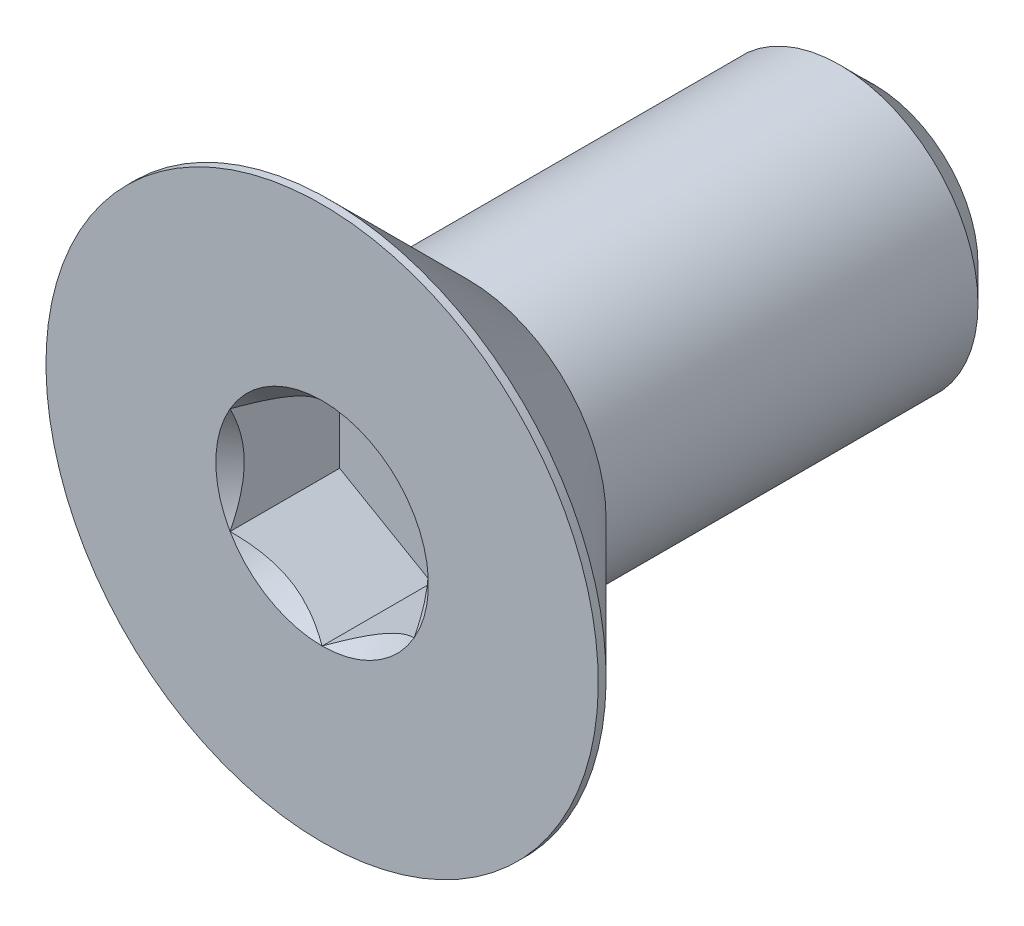
ISO-10303-21;
HEADER;
FILE_DESCRIPTION(('STEP AP214'),'2;1');
FILE_NAME('part.step','',(''),(''),'','','');
FILE_SCHEMA(('AUTOMOTIVE_DESIGN { 1 0 10303 214 1 1 1 1 }'));
ENDSEC;
DATA;
#1=APPLICATION_CONTEXT('core data for automotive mechanical design processes');
#2=APPLICATION_PROTOCOL_DEFINITION('international standard','automotive_design',2000,#1);
#3=PRODUCT_CONTEXT('',#1,'mechanical');
#4=PRODUCT('Part','Part','',(#3));
#5=PRODUCT_RELATED_PRODUCT_CATEGORY('part','',(#4));
#6=PRODUCT_DEFINITION_FORMATION('','',#4);
#7=PRODUCT_DEFINITION_CONTEXT('part definition',#1,'design');
#8=PRODUCT_DEFINITION('design','',#6,#7);
#9=PRODUCT_DEFINITION_SHAPE('','',#8);
#10=(LENGTH_UNIT() NAMED_UNIT(*) SI_UNIT(.MILLI.,.METRE.));
#11=(NAMED_UNIT(*) PLANE_ANGLE_UNIT() SI_UNIT($,.RADIAN.));
#12=(NAMED_UNIT(*) SI_UNIT($,.STERADIAN.) SOLID_ANGLE_UNIT());
#13=UNCERTAINTY_MEASURE_WITH_UNIT(LENGTH_MEASURE(1.E-05),#10,'distance_accuracy_value','');
#14=(GEOMETRIC_REPRESENTATION_CONTEXT(3) GLOBAL_UNCERTAINTY_ASSIGNED_CONTEXT((#13)) GLOBAL_UNIT_ASSIGNED_CONTEXT((#10,
#11,#12)) REPRESENTATION_CONTEXT('',''));
#15=CARTESIAN_POINT('',(0.,0.,0.));
#16=DIRECTION('',(0.,0.,1.));
#17=DIRECTION('',(1.,0.,0.));
#18=AXIS2_PLACEMENT_3D('',#15,#16,#17);
#19=CARTESIAN_POINT('',(0.,0.,2.915));
#20=DIRECTION('',(0.,0.,1.));
#21=DIRECTION('',(0.,-1.,0.));
#22=AXIS2_PLACEMENT_3D('',#19,#20,#21);
#23=CONICAL_SURFACE('',#22,3.,0.785398163397448);
#24=CARTESIAN_POINT('',(0.,0.,2.915));
#25=DIRECTION('',(0.,0.,1.));
#26=DIRECTION('',(0.,-1.,0.));
#27=AXIS2_PLACEMENT_3D('',#24,#25,#26);
#28=CIRCLE('',#27,3.);
#29=CARTESIAN_POINT('',(0.,-3.,2.915));
#30=VERTEX_POINT('',#29);
#31=EDGE_CURVE('E48',#30,#30,#28,.T.);
#32=ORIENTED_EDGE('',*,*,#31,.F.);
#33=EDGE_LOOP('',(#32));
#34=FACE_BOUND('',#33,.T.);
#35=CARTESIAN_POINT('',(0.,0.,1.41500000000001));
#36=DIRECTION('',(0.,0.,1.));
#37=DIRECTION('',(0.,-1.,0.));
#38=AXIS2_PLACEMENT_3D('',#35,#36,#37);
#39=CIRCLE('',#38,1.50000000000001);
#40=CARTESIAN_POINT('',(0.,-1.50000000000001,1.41500000000001));
#41=VERTEX_POINT('',#40);
#42=EDGE_CURVE('E43',#41,#41,#39,.T.);
#43=ORIENTED_EDGE('',*,*,#42,.T.);
#44=EDGE_LOOP('',(#43));
#45=FACE_BOUND('',#44,.T.);
#46=ADVANCED_FACE('F40',(#34,#45),#23,.T.);
#47=CARTESIAN_POINT('',(0.,0.,3.));
#48=DIRECTION('',(0.,0.,-1.));
#49=DIRECTION('',(0.,1.,0.));
#50=AXIS2_PLACEMENT_3D('',#47,#48,#49);
#51=PLANE('',#50);
#52=CARTESIAN_POINT('',(0.,0.,3.));
#53=DIRECTION('',(0.,0.,1.));
#54=DIRECTION('',(0.,-1.,0.));
#55=AXIS2_PLACEMENT_3D('',#52,#53,#54);
#56=CIRCLE('',#55,3.);
#57=CARTESIAN_POINT('',(0.,-3.,3.));
#58=VERTEX_POINT('',#57);
#59=EDGE_CURVE('E257',#58,#58,#56,.T.);
#60=ORIENTED_EDGE('',*,*,#59,.T.);
#61=EDGE_LOOP('',(#60));
#62=FACE_BOUND('',#61,.T.);
#63=CARTESIAN_POINT('',(0.,0.,3.));
#64=DIRECTION('',(0.,0.,-1.));
#65=DIRECTION('',(-1.,0.,0.));
#66=AXIS2_PLACEMENT_3D('',#63,#64,#65);
#67=CIRCLE('',#66,1.15470053837925);
#68=CARTESIAN_POINT('',(-1.,0.577350269189623,3.));
#69=VERTEX_POINT('',#68);
#70=CARTESIAN_POINT('',(0.,1.15470053837925,3.));
#71=VERTEX_POINT('',#70);
#72=EDGE_CURVE('E130',#69,#71,#67,.T.);
#73=ORIENTED_EDGE('',*,*,#72,.T.);
#74=CARTESIAN_POINT('',(1.,0.577350269189625,3.));
#75=VERTEX_POINT('',#74);
#76=EDGE_CURVE('E129',#71,#75,#67,.T.);
#77=ORIENTED_EDGE('',*,*,#76,.T.);
#78=CARTESIAN_POINT('',(1.,-0.577350269189626,3.));
#79=VERTEX_POINT('',#78);
#80=EDGE_CURVE('E100',#75,#79,#67,.T.);
#81=ORIENTED_EDGE('',*,*,#80,.T.);
#82=CARTESIAN_POINT('',(0.,-1.15470053837925,3.));
#83=VERTEX_POINT('',#82);
#84=EDGE_CURVE('E93',#79,#83,#67,.T.);
#85=ORIENTED_EDGE('',*,*,#84,.T.);
#86=CARTESIAN_POINT('',(-1.,-0.577350269189628,3.));
#87=VERTEX_POINT('',#86);
#88=EDGE_CURVE('E54',#83,#87,#67,.T.);
#89=ORIENTED_EDGE('',*,*,#88,.T.);
#90=EDGE_CURVE('E61',#87,#69,#67,.T.);
#91=ORIENTED_EDGE('',*,*,#90,.T.);
#92=EDGE_LOOP('',(#73,#77,#81,#85,#89,#91));
#93=FACE_BOUND('',#92,.T.);
#94=ADVANCED_FACE('F128',(#62,#93),#51,.F.);
#95=CARTESIAN_POINT('',(0.,0.,3.));
#96=DIRECTION('',(0.,0.,1.));
#97=DIRECTION('',(0.,-1.,0.));
#98=AXIS2_PLACEMENT_3D('',#95,#96,#97);
#99=CYLINDRICAL_SURFACE('',#98,3.);
#100=ORIENTED_EDGE('',*,*,#31,.T.);
#101=EDGE_LOOP('',(#100));
#102=FACE_BOUND('',#101,.T.);
#103=ORIENTED_EDGE('',*,*,#59,.F.);
#104=EDGE_LOOP('',(#103));
#105=FACE_BOUND('',#104,.T.);
#106=ADVANCED_FACE('F212',(#102,#105),#99,.T.);
#107=CARTESIAN_POINT('',(0.,0.,3.));
#108=DIRECTION('',(0.,0.,1.));
#109=DIRECTION('',(-1.,0.,0.));
#110=AXIS2_PLACEMENT_3D('',#107,#108,#109);
#111=CONICAL_SURFACE('',#110,1.15470053837925,0.78539816339745);
#112=CARTESIAN_POINT('',(1.,-1.15147208646462,3.37038567751387));
#113=CARTESIAN_POINT('',(1.,-1.12343447988552,3.34921991987372));
#114=CARTESIAN_POINT('',(1.,-1.09524064850698,3.32826169217591));
#115=CARTESIAN_POINT('',(1.,-1.03847715644377,3.28684602223563));
#116=CARTESIAN_POINT('',(1.,-1.00990740382975,3.26638870612366));
#117=CARTESIAN_POINT('',(1.,-0.92312089433348,3.20560479495451));
#118=CARTESIAN_POINT('',(1.,-0.864253173759063,3.1661922289614));
#119=CARTESIAN_POINT('',(1.,-0.740809858258048,3.08882066420021));
#120=CARTESIAN_POINT('',(1.,-0.676100255137809,3.05107303911435));
#121=CARTESIAN_POINT('',(1.,-0.543448939049126,2.98202458755129));
#122=CARTESIAN_POINT('',(1.,-0.47551911202778,2.95070202784687));
#123=CARTESIAN_POINT('',(1.,-0.37355585033353,2.9123817788838));
#124=CARTESIAN_POINT('',(1.,-0.341031989670909,2.90138359164216));
#125=CARTESIAN_POINT('',(1.,-0.275199079052294,2.88199834214736));
#126=CARTESIAN_POINT('',(1.,-0.241889975173934,2.8736114597767));
#127=CARTESIAN_POINT('',(1.,-0.175247517042994,2.86002522071902));
#128=CARTESIAN_POINT('',(1.,-0.141925568218176,2.85477079076797));
#129=CARTESIAN_POINT('',(1.,-0.0749144362322797,2.84754868657089));
#130=CARTESIAN_POINT('',(1.,-0.0412251978501624,2.84558151361051));
#131=CARTESIAN_POINT('',(1.,0.0249580992634205,2.84508319839316));
#132=CARTESIAN_POINT('',(1.,0.057451282646039,2.84643026788864));
#133=CARTESIAN_POINT('',(1.,0.122148505701867,2.85221648449899));
#134=CARTESIAN_POINT('',(1.,0.154352610132926,2.85665492066154));
#135=CARTESIAN_POINT('',(1.,0.21879989886764,2.86845683014521));
#136=CARTESIAN_POINT('',(1.,0.251033743268954,2.87587054103851));
#137=CARTESIAN_POINT('',(1.,0.314797132354919,2.89322894249868));
#138=CARTESIAN_POINT('',(1.,0.346326735731005,2.90317342128883));
#139=CARTESIAN_POINT('',(1.,0.445594187730206,2.93822348255434));
#140=CARTESIAN_POINT('',(1.,0.511919139476037,2.96732085835673));
#141=CARTESIAN_POINT('',(1.,0.641453244657533,3.03201532968651));
#142=CARTESIAN_POINT('',(1.,0.704650133126345,3.06763577671524));
#143=CARTESIAN_POINT('',(1.,0.825428490174987,3.14112390134694));
#144=CARTESIAN_POINT('',(1.,0.883132947867685,3.17879194713547));
#145=CARTESIAN_POINT('',(1.,0.968148853704566,3.23702285294317));
#146=CARTESIAN_POINT('',(1.,0.996120570380285,3.25663847576286));
#147=CARTESIAN_POINT('',(1.,1.05168177729902,3.29638851706127));
#148=CARTESIAN_POINT('',(1.,1.079271369977,3.31652279219883));
#149=CARTESIAN_POINT('',(1.,1.10670185346329,3.33687211907297));
#150=B_SPLINE_CURVE_WITH_KNOTS('',3,(#112,#113,#114,#115,#116,#117,#118,#119,#120,#121,#122,
#123,#124,#125,#126,#127,#128,#129,#130,#131,#132,#133,#134,#135,#136,#137,#138,#139,#140,#141,
#142,#143,#144,#145,#146,#147,#148,#149),.UNSPECIFIED.,.F.,.F.,(4,2,2,2,2,2,2,2,2,2,2,2,2,2,2,2,
2,2,4),(0.,0.105386459083291,0.210799187330125,0.42323361156547,0.647793540908506,
0.871580877738613,0.974493074181424,1.07741235827202,1.17846428203205,1.27953161415763,
1.37694086739611,1.47432772585408,1.57343322804294,1.67253043972852,1.88917353996828,
2.10660791038813,2.31323734249844,2.41572589232045,2.51818641476504),.UNSPECIFIED.);
#151=EDGE_CURVE('E11',#75,#79,#150,.F.);
#152=ORIENTED_EDGE('',*,*,#151,.T.);
#153=ORIENTED_EDGE('',*,*,#80,.F.);
#154=EDGE_LOOP('',(#152,#153));
#155=FACE_BOUND('',#154,.T.);
#156=ADVANCED_FACE('F105',(#155),#111,.F.);
#157=CARTESIAN_POINT('',(-0.000199999999999349,1.15481600843309,3.00011548737261));
#158=CARTESIAN_POINT('',(0.0341825950071813,1.13496520795026,2.98027793082573));
#159=CARTESIAN_POINT('',(0.0691401181398255,1.11478247255942,2.96160502063889));
#160=CARTESIAN_POINT('',(0.14042280295609,1.07362739529219,2.92741474272316));
#161=CARTESIAN_POINT('',(0.176754750528984,1.0526511355808,2.91191640902346));
#162=CARTESIAN_POINT('',(0.250016613803311,1.01035337909803,2.88536730714227));
#163=CARTESIAN_POINT('',(0.286927851445414,0.989042666109241,2.87424977399693));
#164=CARTESIAN_POINT('',(0.361562729310859,0.945952199282692,2.85711986577618));
#165=CARTESIAN_POINT('',(0.399284088108636,0.924173762626597,2.85109469746667));
#166=CARTESIAN_POINT('',(0.464292198417933,0.886641312640015,2.84566055496749));
#167=CARTESIAN_POINT('',(0.491494371528172,0.870936130672276,2.84485693831673));
#168=CARTESIAN_POINT('',(0.545846040669112,0.839556179862849,2.84620669941689));
#169=CARTESIAN_POINT('',(0.572995523754876,0.823881418494924,2.8483607295472));
#170=CARTESIAN_POINT('',(0.65405627732696,0.777080970599367,2.85911697212847));
#171=CARTESIAN_POINT('',(0.707564140978427,0.746188191116431,2.87201455641536));
#172=CARTESIAN_POINT('',(0.801476065143432,0.69196811641965,2.90314073060218));
#173=CARTESIAN_POINT('',(0.842320523671835,0.668386557293372,2.91973779770184));
#174=CARTESIAN_POINT('',(0.922409637381945,0.622147085933681,2.95712492468529));
#175=CARTESIAN_POINT('',(0.96165901087044,0.599486449584575,2.9779013418174));
#176=CARTESIAN_POINT('',(1.0002,0.577234799135787,3.00011548737262));
#177=B_SPLINE_CURVE_WITH_KNOTS('',3,(#157,#158,#159,#160,#161,#162,#163,#164,#165,#166,#167,
#168,#169,#170,#171,#172,#173,#174,#175,#176),.UNSPECIFIED.,.F.,.F.,(4,2,2,2,2,2,2,2,2,4),(0.,
0.133237676828559,0.26725222983449,0.399137076269299,0.530689603280767,0.624814864263845,
0.718960890149132,0.907306626112096,1.05710100361789,1.20641411519286),.UNSPECIFIED.);
#178=EDGE_CURVE('E133',#71,#75,#177,.T.);
#179=ORIENTED_EDGE('',*,*,#178,.T.);
#180=ORIENTED_EDGE('',*,*,#76,.F.);
#181=EDGE_LOOP('',(#179,#180));
#182=FACE_BOUND('',#181,.T.);
#183=ADVANCED_FACE('F253',(#182),#111,.F.);
#184=CARTESIAN_POINT('',(-1.0002,0.577234799135787,3.00011548737261));
#185=CARTESIAN_POINT('',(-0.965817404992821,0.59708559961862,2.98027793082573));
#186=CARTESIAN_POINT('',(-0.930859881860177,0.617268335009455,2.96160502063889));
#187=CARTESIAN_POINT('',(-0.859577197043912,0.658423412276685,2.92741474272316));
#188=CARTESIAN_POINT('',(-0.823245249471017,0.679399671988079,2.91191640902346));
#189=CARTESIAN_POINT('',(-0.74998338619669,0.721697428470845,2.88536730714227));
#190=CARTESIAN_POINT('',(-0.713072148554587,0.743008141459636,2.87424977399693));
#191=CARTESIAN_POINT('',(-0.638437270689142,0.786098608286185,2.85711986577618));
#192=CARTESIAN_POINT('',(-0.600715911891365,0.80787704494228,2.85109469746667));
#193=CARTESIAN_POINT('',(-0.535707801582067,0.845409494928862,2.84566055496749));
#194=CARTESIAN_POINT('',(-0.508505628471828,0.861114676896601,2.84485693831673));
#195=CARTESIAN_POINT('',(-0.454153959330889,0.892494627706028,2.84620669941689));
#196=CARTESIAN_POINT('',(-0.427004476245125,0.908169389073953,2.8483607295472));
#197=CARTESIAN_POINT('',(-0.34594372267304,0.95496983696951,2.85911697212847));
#198=CARTESIAN_POINT('',(-0.292435859021573,0.985862616452446,2.87201455641536));
#199=CARTESIAN_POINT('',(-0.198523934856569,1.04008269114923,2.90314073060218));
#200=CARTESIAN_POINT('',(-0.157679476328166,1.06366425027551,2.91973779770184));
#201=CARTESIAN_POINT('',(-0.077590362618056,1.1099037216352,2.95712492468529));
#202=CARTESIAN_POINT('',(-0.0383409891295617,1.1325643579843,2.9779013418174));
#203=CARTESIAN_POINT('',(0.000200000000000743,1.15481600843309,3.00011548737261));
#204=B_SPLINE_CURVE_WITH_KNOTS('',3,(#184,#185,#186,#187,#188,#189,#190,#191,#192,#193,#194,
#195,#196,#197,#198,#199,#200,#201,#202,#203),.UNSPECIFIED.,.F.,.F.,(4,2,2,2,2,2,2,2,2,4),(0.,
0.133237676828559,0.267252229834491,0.399137076269301,0.53068960328077,0.624814864263847,
0.718960890149134,0.907306626112098,1.0571010036179,1.20641411519286),.UNSPECIFIED.);
#205=EDGE_CURVE('E143',#69,#71,#204,.T.);
#206=ORIENTED_EDGE('',*,*,#205,.T.);
#207=ORIENTED_EDGE('',*,*,#72,.F.);
#208=EDGE_LOOP('',(#206,#207));
#209=FACE_BOUND('',#208,.T.);
#210=ADVANCED_FACE('F289',(#209),#111,.F.);
#211=CARTESIAN_POINT('',(-1.,-1.15147208646462,3.37038567751387));
#212=CARTESIAN_POINT('',(-1.,-1.12343447988553,3.34921991987372));
#213=CARTESIAN_POINT('',(-1.,-1.09524064850698,3.32826169217592));
#214=CARTESIAN_POINT('',(-1.,-1.03847715644377,3.28684602223563));
#215=CARTESIAN_POINT('',(-1.,-1.00990740382976,3.26638870612366));
#216=CARTESIAN_POINT('',(-1.,-0.923120894333483,3.20560479495451));
#217=CARTESIAN_POINT('',(-1.,-0.864253173759066,3.1661922289614));
#218=CARTESIAN_POINT('',(-1.,-0.740809858258051,3.08882066420021));
#219=CARTESIAN_POINT('',(-1.,-0.676100255137812,3.05107303911435));
#220=CARTESIAN_POINT('',(-1.,-0.543448939049128,2.9820245875513));
#221=CARTESIAN_POINT('',(-1.,-0.475519112027782,2.95070202784687));
#222=CARTESIAN_POINT('',(-1.,-0.373555850333531,2.9123817788838));
#223=CARTESIAN_POINT('',(-1.,-0.34103198967091,2.90138359164216));
#224=CARTESIAN_POINT('',(-1.,-0.275199079052295,2.88199834214736));
#225=CARTESIAN_POINT('',(-1.,-0.241889975173935,2.8736114597767));
#226=CARTESIAN_POINT('',(-1.,-0.175247517042994,2.86002522071902));
#227=CARTESIAN_POINT('',(-1.,-0.141925568218177,2.85477079076797));
#228=CARTESIAN_POINT('',(-1.,-0.0749144362322805,2.84754868657089));
#229=CARTESIAN_POINT('',(-1.,-0.0412251978501632,2.84558151361051));
#230=CARTESIAN_POINT('',(-1.,0.0249580992634197,2.84508319839316));
#231=CARTESIAN_POINT('',(-1.,0.057451282646038,2.84643026788864));
#232=CARTESIAN_POINT('',(-1.,0.122148505701866,2.85221648449899));
#233=CARTESIAN_POINT('',(-1.,0.154352610132925,2.85665492066154));
#234=CARTESIAN_POINT('',(-1.,0.218799898867639,2.8684568301452));
#235=CARTESIAN_POINT('',(-1.,0.251033743268953,2.87587054103851));
#236=CARTESIAN_POINT('',(-1.,0.314797132354918,2.89322894249868));
#237=CARTESIAN_POINT('',(-1.,0.346326735731004,2.90317342128883));
#238=CARTESIAN_POINT('',(-1.,0.445594187730205,2.93822348255434));
#239=CARTESIAN_POINT('',(-1.,0.511919139476036,2.96732085835673));
#240=CARTESIAN_POINT('',(-1.,0.641453244657532,3.03201532968651));
#241=CARTESIAN_POINT('',(-1.,0.704650133126344,3.06763577671524));
#242=CARTESIAN_POINT('',(-1.,0.825428490174987,3.14112390134694));
#243=CARTESIAN_POINT('',(-1.,0.883132947867685,3.17879194713546));
#244=CARTESIAN_POINT('',(-1.,0.968148853704565,3.23702285294316));
#245=CARTESIAN_POINT('',(-1.,0.996120570380285,3.25663847576286));
#246=CARTESIAN_POINT('',(-1.,1.05168177729901,3.29638851706127));
#247=CARTESIAN_POINT('',(-1.,1.079271369977,3.31652279219883));
#248=CARTESIAN_POINT('',(-1.,1.10670185346329,3.33687211907297));
#249=B_SPLINE_CURVE_WITH_KNOTS('',3,(#211,#212,#213,#214,#215,#216,#217,#218,#219,#220,#221,
#222,#223,#224,#225,#226,#227,#228,#229,#230,#231,#232,#233,#234,#235,#236,#237,#238,#239,#240,
#241,#242,#243,#244,#245,#246,#247,#248),.UNSPECIFIED.,.F.,.F.,(4,2,2,2,2,2,2,2,2,2,2,2,2,2,2,2,
2,2,4),(0.,0.105386459083292,0.210799187330125,0.423233611565471,0.647793540908508,
0.871580877738616,0.974493074181428,1.07741235827202,1.17846428203205,1.27953161415763,
1.37694086739611,1.47432772585409,1.57343322804294,1.67253043972852,1.88917353996828,
2.10660791038814,2.31323734249844,2.41572589232045,2.51818641476504),.UNSPECIFIED.);
#250=EDGE_CURVE('E172',#87,#69,#249,.T.);
#251=ORIENTED_EDGE('',*,*,#250,.T.);
#252=ORIENTED_EDGE('',*,*,#90,.F.);
#253=EDGE_LOOP('',(#251,#252));
#254=FACE_BOUND('',#253,.T.);
#255=ADVANCED_FACE('F297',(#254),#111,.F.);
#256=CARTESIAN_POINT('',(0.000199999999999969,-1.15481600843309,3.00011548737262));
#257=CARTESIAN_POINT('',(-0.0341825950071807,-1.13496520795026,2.98027793082574));
#258=CARTESIAN_POINT('',(-0.069140118139825,-1.11478247255942,2.96160502063889));
#259=CARTESIAN_POINT('',(-0.14042280295609,-1.0736273952922,2.92741474272316));
#260=CARTESIAN_POINT('',(-0.176754750528985,-1.0526511355808,2.91191640902346));
#261=CARTESIAN_POINT('',(-0.250016613803312,-1.01035337909803,2.88536730714227));
#262=CARTESIAN_POINT('',(-0.286927851445415,-0.989042666109244,2.87424977399693));
#263=CARTESIAN_POINT('',(-0.36156272931086,-0.945952199282694,2.85711986577619));
#264=CARTESIAN_POINT('',(-0.399284088108637,-0.9241737626266,2.85109469746668));
#265=CARTESIAN_POINT('',(-0.464292198417935,-0.886641312640018,2.8456605549675));
#266=CARTESIAN_POINT('',(-0.491494371528173,-0.870936130672279,2.84485693831674));
#267=CARTESIAN_POINT('',(-0.545846040669113,-0.839556179862851,2.84620669941689));
#268=CARTESIAN_POINT('',(-0.572995523754877,-0.823881418494927,2.8483607295472));
#269=CARTESIAN_POINT('',(-0.654056277326962,-0.77708097059937,2.85911697212848));
#270=CARTESIAN_POINT('',(-0.707564140978429,-0.746188191116433,2.87201455641536));
#271=CARTESIAN_POINT('',(-0.801476065143434,-0.691968116419652,2.90314073060218));
#272=CARTESIAN_POINT('',(-0.842320523671836,-0.668386557293374,2.91973779770184));
#273=CARTESIAN_POINT('',(-0.922409637381945,-0.622147085933684,2.9571249246853));
#274=CARTESIAN_POINT('',(-0.961659010870439,-0.599486449584578,2.97790134181741));
#275=CARTESIAN_POINT('',(-1.0002,-0.577234799135791,3.00011548737262));
#276=B_SPLINE_CURVE_WITH_KNOTS('',3,(#256,#257,#258,#259,#260,#261,#262,#263,#264,#265,#266,
#267,#268,#269,#270,#271,#272,#273,#274,#275),.UNSPECIFIED.,.F.,.F.,(4,2,2,2,2,2,2,2,2,4),(0.,
0.13323767682856,0.267252229834491,0.399137076269301,0.53068960328077,0.624814864263848,
0.718960890149135,0.9073066261121,1.0571010036179,1.20641411519286),.UNSPECIFIED.);
#277=EDGE_CURVE('E117',#83,#87,#276,.T.);
#278=ORIENTED_EDGE('',*,*,#277,.T.);
#279=ORIENTED_EDGE('',*,*,#88,.F.);
#280=EDGE_LOOP('',(#278,#279));
#281=FACE_BOUND('',#280,.T.);
#282=ADVANCED_FACE('F158',(#281),#111,.F.);
#283=CARTESIAN_POINT('',(1.0002,-0.57723479913579,3.00011548737262));
#284=CARTESIAN_POINT('',(0.965817404992821,-0.597085599618624,2.98027793082574));
#285=CARTESIAN_POINT('',(0.930859881860177,-0.617268335009459,2.96160502063889));
#286=CARTESIAN_POINT('',(0.859577197043912,-0.658423412276688,2.92741474272316));
#287=CARTESIAN_POINT('',(0.823245249471018,-0.679399671988082,2.91191640902346));
#288=CARTESIAN_POINT('',(0.749983386196691,-0.721697428470849,2.88536730714227));
#289=CARTESIAN_POINT('',(0.713072148554587,-0.743008141459639,2.87424977399693));
#290=CARTESIAN_POINT('',(0.638437270689143,-0.786098608286189,2.85711986577619));
#291=CARTESIAN_POINT('',(0.600715911891366,-0.807877044942283,2.85109469746668));
#292=CARTESIAN_POINT('',(0.535707801582068,-0.845409494928865,2.8456605549675));
#293=CARTESIAN_POINT('',(0.50850562847183,-0.861114676896604,2.84485693831674));
#294=CARTESIAN_POINT('',(0.45415395933089,-0.892494627706031,2.84620669941689));
#295=CARTESIAN_POINT('',(0.427004476245126,-0.908169389073956,2.8483607295472));
#296=CARTESIAN_POINT('',(0.345943722673041,-0.954969836969514,2.85911697212847));
#297=CARTESIAN_POINT('',(0.292435859021574,-0.98586261645245,2.87201455641536));
#298=CARTESIAN_POINT('',(0.198523934856569,-1.04008269114923,2.90314073060218));
#299=CARTESIAN_POINT('',(0.157679476328166,-1.06366425027551,2.91973779770184));
#300=CARTESIAN_POINT('',(0.0775903626180566,-1.1099037216352,2.9571249246853));
#301=CARTESIAN_POINT('',(0.0383409891295624,-1.13256435798431,2.97790134181741));
#302=CARTESIAN_POINT('',(-0.000199999999999908,-1.15481600843309,3.00011548737262));
#303=B_SPLINE_CURVE_WITH_KNOTS('',3,(#283,#284,#285,#286,#287,#288,#289,#290,#291,#292,#293,
#294,#295,#296,#297,#298,#299,#300,#301,#302),.UNSPECIFIED.,.F.,.F.,(4,2,2,2,2,2,2,2,2,4),(0.,
0.133237676828559,0.26725222983449,0.3991370762693,0.530689603280768,0.624814864263846,
0.718960890149133,0.907306626112098,1.0571010036179,1.20641411519286),.UNSPECIFIED.);
#304=EDGE_CURVE('E96',#79,#83,#303,.T.);
#305=ORIENTED_EDGE('',*,*,#304,.T.);
#306=ORIENTED_EDGE('',*,*,#84,.F.);
#307=EDGE_LOOP('',(#305,#306));
#308=FACE_BOUND('',#307,.T.);
#309=ADVANCED_FACE('F94',(#308),#111,.F.);
#310=CARTESIAN_POINT('',(1.,-0.577350269189628,1.81));
#311=DIRECTION('',(0.,0.,1.));
#312=DIRECTION('',(1.,0.,0.));
#313=AXIS2_PLACEMENT_3D('',#310,#311,#312);
#314=PLANE('',#313);
#315=DIRECTION('',(0.866025403784438,0.5,0.));
#316=VECTOR('',#315,1.);
#317=CARTESIAN_POINT('',(0.,-1.15470053837926,1.81));
#318=LINE('',#317,#316);
#319=CARTESIAN_POINT('',(0.,-1.15470053837926,1.81));
#320=VERTEX_POINT('',#319);
#321=CARTESIAN_POINT('',(1.,-0.577350269189628,1.81));
#322=VERTEX_POINT('',#321);
#323=EDGE_CURVE('E116',#320,#322,#318,.T.);
#324=ORIENTED_EDGE('',*,*,#323,.T.);
#325=DIRECTION('',(0.,1.,0.));
#326=VECTOR('',#325,1.);
#327=CARTESIAN_POINT('',(1.,-0.577350269189628,1.81));
#328=LINE('',#327,#326);
#329=CARTESIAN_POINT('',(1.,0.577350269189625,1.81));
#330=VERTEX_POINT('',#329);
#331=EDGE_CURVE('E121',#322,#330,#328,.T.);
#332=ORIENTED_EDGE('',*,*,#331,.T.);
#333=DIRECTION('',(-0.866025403784439,0.5,0.));
#334=VECTOR('',#333,1.);
#335=CARTESIAN_POINT('',(1.,0.577350269189625,1.81));
#336=LINE('',#335,#334);
#337=CARTESIAN_POINT('',(0.,1.15470053837925,1.81));
#338=VERTEX_POINT('',#337);
#339=EDGE_CURVE('E279',#330,#338,#336,.T.);
#340=ORIENTED_EDGE('',*,*,#339,.T.);
#341=DIRECTION('',(-0.866025403784439,-0.5,0.));
#342=VECTOR('',#341,1.);
#343=CARTESIAN_POINT('',(0.,1.15470053837925,1.81));
#344=LINE('',#343,#342);
#345=CARTESIAN_POINT('',(-1.,0.577350269189625,1.81));
#346=VERTEX_POINT('',#345);
#347=EDGE_CURVE('E276',#338,#346,#344,.T.);
#348=ORIENTED_EDGE('',*,*,#347,.T.);
#349=DIRECTION('',(0.,-1.,0.));
#350=VECTOR('',#349,1.);
#351=CARTESIAN_POINT('',(-1.,0.577350269189625,1.81));
#352=LINE('',#351,#350);
#353=CARTESIAN_POINT('',(-1.,-0.577350269189629,1.81));
#354=VERTEX_POINT('',#353);
#355=EDGE_CURVE('E273',#346,#354,#352,.T.);
#356=ORIENTED_EDGE('',*,*,#355,.T.);
#357=DIRECTION('',(0.866025403784439,-0.5,0.));
#358=VECTOR('',#357,1.);
#359=CARTESIAN_POINT('',(-1.,-0.577350269189629,1.81));
#360=LINE('',#359,#358);
#361=EDGE_CURVE('E124',#354,#320,#360,.T.);
#362=ORIENTED_EDGE('',*,*,#361,.T.);
#363=EDGE_LOOP('',(#324,#332,#340,#348,#356,#362));
#364=FACE_BOUND('',#363,.T.);
#365=ADVANCED_FACE('F157',(#364),#314,.T.);
#366=CARTESIAN_POINT('',(1.,-0.577350269189628,1.81));
#367=DIRECTION('',(1.,0.,0.));
#368=DIRECTION('',(0.,1.,0.));
#369=AXIS2_PLACEMENT_3D('',#366,#367,#368);
#370=PLANE('',#369);
#371=ORIENTED_EDGE('',*,*,#151,.F.);
#372=DIRECTION('',(0.,0.,1.));
#373=VECTOR('',#372,1.);
#374=CARTESIAN_POINT('',(1.,0.577350269189625,1.81));
#375=LINE('',#374,#373);
#376=EDGE_CURVE('E123',#330,#75,#375,.T.);
#377=ORIENTED_EDGE('',*,*,#376,.F.);
#378=ORIENTED_EDGE('',*,*,#331,.F.);
#379=DIRECTION('',(0.,0.,1.));
#380=VECTOR('',#379,1.);
#381=CARTESIAN_POINT('',(1.,-0.577350269189628,1.81));
#382=LINE('',#381,#380);
#383=EDGE_CURVE('E113',#322,#79,#382,.T.);
#384=ORIENTED_EDGE('',*,*,#383,.T.);
#385=EDGE_LOOP('',(#371,#377,#378,#384));
#386=FACE_BOUND('',#385,.T.);
#387=ADVANCED_FACE('F119',(#386),#370,.F.);
#388=CARTESIAN_POINT('',(1.,0.577350269189625,1.81));
#389=DIRECTION('',(0.5,0.866025403784439,0.));
#390=DIRECTION('',(-0.866025403784439,0.5,0.));
#391=AXIS2_PLACEMENT_3D('',#388,#389,#390);
#392=PLANE('',#391);
#393=ORIENTED_EDGE('',*,*,#178,.F.);
#394=DIRECTION('',(0.,0.,1.));
#395=VECTOR('',#394,1.);
#396=CARTESIAN_POINT('',(0.,1.15470053837925,1.81));
#397=LINE('',#396,#395);
#398=EDGE_CURVE('E263',#338,#71,#397,.T.);
#399=ORIENTED_EDGE('',*,*,#398,.F.);
#400=ORIENTED_EDGE('',*,*,#339,.F.);
#401=ORIENTED_EDGE('',*,*,#376,.T.);
#402=EDGE_LOOP('',(#393,#399,#400,#401));
#403=FACE_BOUND('',#402,.T.);
#404=ADVANCED_FACE('F150',(#403),#392,.F.);
#405=CARTESIAN_POINT('',(0.,1.15470053837925,1.81));
#406=DIRECTION('',(-0.5,0.866025403784439,0.));
#407=DIRECTION('',(-0.866025403784439,-0.5,0.));
#408=AXIS2_PLACEMENT_3D('',#405,#406,#407);
#409=PLANE('',#408);
#410=ORIENTED_EDGE('',*,*,#205,.F.);
#411=DIRECTION('',(0.,0.,1.));
#412=VECTOR('',#411,1.);
#413=CARTESIAN_POINT('',(-1.,0.577350269189625,1.81));
#414=LINE('',#413,#412);
#415=EDGE_CURVE('E266',#346,#69,#414,.T.);
#416=ORIENTED_EDGE('',*,*,#415,.F.);
#417=ORIENTED_EDGE('',*,*,#347,.F.);
#418=ORIENTED_EDGE('',*,*,#398,.T.);
#419=EDGE_LOOP('',(#410,#416,#417,#418));
#420=FACE_BOUND('',#419,.T.);
#421=ADVANCED_FACE('F196',(#420),#409,.F.);
#422=CARTESIAN_POINT('',(-1.,0.577350269189625,1.81));
#423=DIRECTION('',(-1.,0.,0.));
#424=DIRECTION('',(0.,-1.,0.));
#425=AXIS2_PLACEMENT_3D('',#422,#423,#424);
#426=PLANE('',#425);
#427=ORIENTED_EDGE('',*,*,#250,.F.);
#428=DIRECTION('',(0.,0.,1.));
#429=VECTOR('',#428,1.);
#430=CARTESIAN_POINT('',(-1.,-0.577350269189629,1.81));
#431=LINE('',#430,#429);
#432=EDGE_CURVE('E259',#354,#87,#431,.T.);
#433=ORIENTED_EDGE('',*,*,#432,.F.);
#434=ORIENTED_EDGE('',*,*,#355,.F.);
#435=ORIENTED_EDGE('',*,*,#415,.T.);
#436=EDGE_LOOP('',(#427,#433,#434,#435));
#437=FACE_BOUND('',#436,.T.);
#438=ADVANCED_FACE('F192',(#437),#426,.F.);
#439=CARTESIAN_POINT('',(-1.,-0.577350269189629,1.81));
#440=DIRECTION('',(-0.5,-0.866025403784439,0.));
#441=DIRECTION('',(0.866025403784439,-0.5,0.));
#442=AXIS2_PLACEMENT_3D('',#439,#440,#441);
#443=PLANE('',#442);
#444=ORIENTED_EDGE('',*,*,#277,.F.);
#445=DIRECTION('',(0.,0.,1.));
#446=VECTOR('',#445,1.);
#447=CARTESIAN_POINT('',(0.,-1.15470053837926,1.81));
#448=LINE('',#447,#446);
#449=EDGE_CURVE('E115',#320,#83,#448,.T.);
#450=ORIENTED_EDGE('',*,*,#449,.F.);
#451=ORIENTED_EDGE('',*,*,#361,.F.);
#452=ORIENTED_EDGE('',*,*,#432,.T.);
#453=EDGE_LOOP('',(#444,#450,#451,#452));
#454=FACE_BOUND('',#453,.T.);
#455=ADVANCED_FACE('F189',(#454),#443,.F.);
#456=CARTESIAN_POINT('',(0.,-1.15470053837926,1.81));
#457=DIRECTION('',(0.5,-0.866025403784439,0.));
#458=DIRECTION('',(0.866025403784439,0.5,0.));
#459=AXIS2_PLACEMENT_3D('',#456,#457,#458);
#460=PLANE('',#459);
#461=ORIENTED_EDGE('',*,*,#304,.F.);
#462=ORIENTED_EDGE('',*,*,#383,.F.);
#463=ORIENTED_EDGE('',*,*,#323,.F.);
#464=ORIENTED_EDGE('',*,*,#449,.T.);
#465=EDGE_LOOP('',(#461,#462,#463,#464));
#466=FACE_BOUND('',#465,.T.);
#467=ADVANCED_FACE('F111',(#466),#460,.F.);
#468=CARTESIAN_POINT('',(0.,-1.5,-3.00000000000001));
#469=DIRECTION('',(0.,0.,1.));
#470=DIRECTION('',(0.,-1.,0.));
#471=AXIS2_PLACEMENT_3D('',#468,#469,#470);
#472=PLANE('',#471);
#473=CARTESIAN_POINT('',(0.,0.,-3.00000000000001));
#474=DIRECTION('',(0.,0.,1.));
#475=DIRECTION('',(0.,-1.,0.));
#476=AXIS2_PLACEMENT_3D('',#473,#474,#475);
#477=CIRCLE('',#476,1.125);
#478=CARTESIAN_POINT('',(0.,-1.125,-3.00000000000001));
#479=VERTEX_POINT('',#478);
#480=EDGE_CURVE('E134',#479,#479,#477,.F.);
#481=ORIENTED_EDGE('',*,*,#480,.T.);
#482=EDGE_LOOP('',(#481));
#483=FACE_BOUND('',#482,.T.);
#484=ADVANCED_FACE('F234',(#483),#472,.F.);
#485=CARTESIAN_POINT('',(0.,0.,1.81));
#486=DIRECTION('',(0.,0.,1.));
#487=DIRECTION('',(0.,-1.,0.));
#488=AXIS2_PLACEMENT_3D('',#485,#486,#487);
#489=CYLINDRICAL_SURFACE('',#488,1.50000000000001);
#490=ORIENTED_EDGE('',*,*,#42,.F.);
#491=EDGE_LOOP('',(#490));
#492=FACE_BOUND('',#491,.T.);
#493=CARTESIAN_POINT('',(0.,0.,-2.625));
#494=DIRECTION('',(0.,0.,1.));
#495=DIRECTION('',(0.,-1.,0.));
#496=AXIS2_PLACEMENT_3D('',#493,#494,#495);
#497=CIRCLE('',#496,1.50000000000001);
#498=CARTESIAN_POINT('',(0.,-1.50000000000001,-2.625));
#499=VERTEX_POINT('',#498);
#500=EDGE_CURVE('E222',#499,#499,#497,.T.);
#501=ORIENTED_EDGE('',*,*,#500,.T.);
#502=EDGE_LOOP('',(#501));
#503=FACE_BOUND('',#502,.T.);
#504=ADVANCED_FACE('F228',(#492,#503),#489,.T.);
#505=CARTESIAN_POINT('',(0.,0.,-2.625));
#506=DIRECTION('',(0.,0.,1.));
#507=DIRECTION('',(0.,-1.,0.));
#508=AXIS2_PLACEMENT_3D('',#505,#506,#507);
#509=CONICAL_SURFACE('',#508,1.50000000000001,0.785398163397451);
#510=ORIENTED_EDGE('',*,*,#480,.F.);
#511=EDGE_LOOP('',(#510));
#512=FACE_BOUND('',#511,.T.);
#513=ORIENTED_EDGE('',*,*,#500,.F.);
#514=EDGE_LOOP('',(#513));
#515=FACE_BOUND('',#514,.T.);
#516=ADVANCED_FACE('F159',(#512,#515),#509,.T.);
#517=CLOSED_SHELL('',(#46,#94,#106,#156,#183,#210,#255,#282,#309,#365,#387,#404,#421,#438,#455,
#467,#484,#504,#516));
#518=MANIFOLD_SOLID_BREP('B2',#517);
#519=ADVANCED_BREP_SHAPE_REPRESENTATION('',(#18,#518),#14);
#520=SHAPE_DEFINITION_REPRESENTATION(#9,#519);
ENDSEC;
END-ISO-10303-21;
